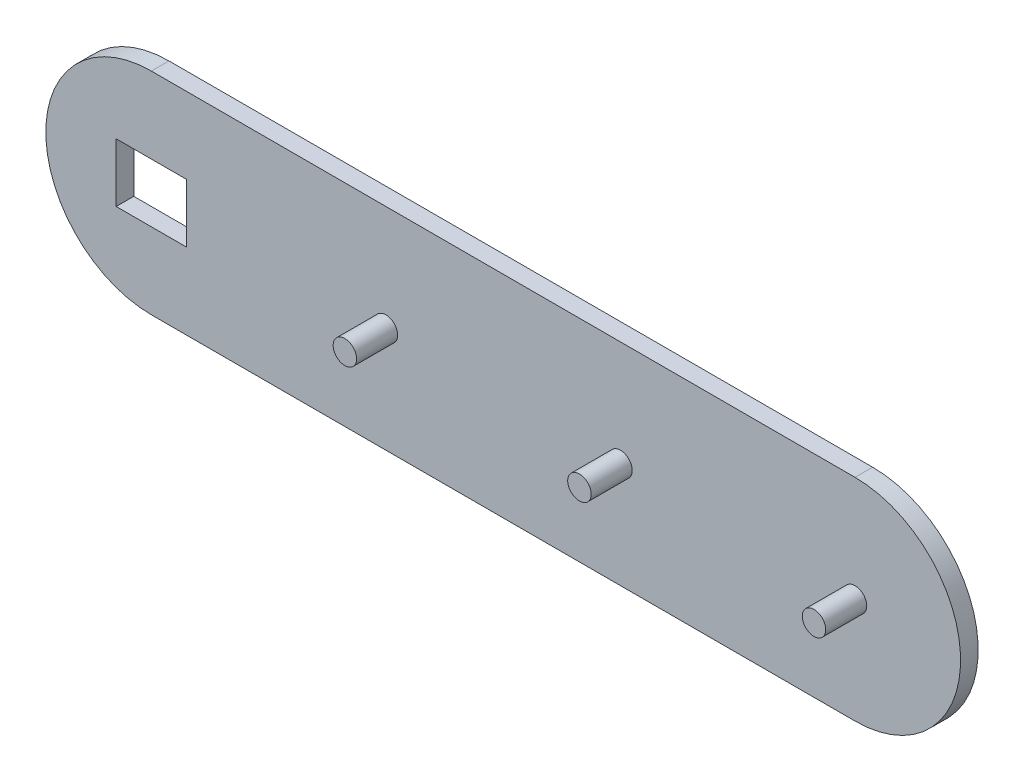
ISO-10303-21;
HEADER;
FILE_DESCRIPTION(('STEP AP214'),'2;1');
FILE_NAME('part.step','',(''),(''),'','','');
FILE_SCHEMA(('AUTOMOTIVE_DESIGN { 1 0 10303 214 1 1 1 1 }'));
ENDSEC;
DATA;
#1=APPLICATION_CONTEXT('core data for automotive mechanical design processes');
#2=APPLICATION_PROTOCOL_DEFINITION('international standard','automotive_design',2000,#1);
#3=PRODUCT_CONTEXT('',#1,'mechanical');
#4=PRODUCT('Part','Part','',(#3));
#5=PRODUCT_RELATED_PRODUCT_CATEGORY('part','',(#4));
#6=PRODUCT_DEFINITION_FORMATION('','',#4);
#7=PRODUCT_DEFINITION_CONTEXT('part definition',#1,'design');
#8=PRODUCT_DEFINITION('design','',#6,#7);
#9=PRODUCT_DEFINITION_SHAPE('','',#8);
#10=(LENGTH_UNIT() NAMED_UNIT(*) SI_UNIT(.MILLI.,.METRE.));
#11=(NAMED_UNIT(*) PLANE_ANGLE_UNIT() SI_UNIT($,.RADIAN.));
#12=(NAMED_UNIT(*) SI_UNIT($,.STERADIAN.) SOLID_ANGLE_UNIT());
#13=UNCERTAINTY_MEASURE_WITH_UNIT(LENGTH_MEASURE(1.E-05),#10,'distance_accuracy_value','');
#14=(GEOMETRIC_REPRESENTATION_CONTEXT(3) GLOBAL_UNCERTAINTY_ASSIGNED_CONTEXT((#13)) GLOBAL_UNIT_ASSIGNED_CONTEXT((#10,
#11,#12)) REPRESENTATION_CONTEXT('',''));
#15=CARTESIAN_POINT('',(0.,0.,0.));
#16=DIRECTION('',(0.,0.,1.));
#17=DIRECTION('',(1.,0.,0.));
#18=AXIS2_PLACEMENT_3D('',#15,#16,#17);
#19=CARTESIAN_POINT('',(40.,0.,10.));
#20=DIRECTION('',(0.,0.,1.));
#21=DIRECTION('',(1.,0.,0.));
#22=AXIS2_PLACEMENT_3D('',#19,#20,#21);
#23=PLANE('',#22);
#24=CARTESIAN_POINT('',(40.,0.,10.));
#25=DIRECTION('',(0.,0.,1.));
#26=DIRECTION('',(1.,0.,0.));
#27=AXIS2_PLACEMENT_3D('',#24,#25,#26);
#28=CIRCLE('',#27,2.);
#29=CARTESIAN_POINT('',(42.,0.,10.));
#30=VERTEX_POINT('',#29);
#31=EDGE_CURVE('E11',#30,#30,#28,.T.);
#32=ORIENTED_EDGE('',*,*,#31,.T.);
#33=EDGE_LOOP('',(#32));
#34=FACE_BOUND('',#33,.T.);
#35=ADVANCED_FACE('F37',(#34),#23,.T.);
#36=CARTESIAN_POINT('',(40.,0.,10.));
#37=DIRECTION('',(0.,0.,-1.));
#38=DIRECTION('',(-1.,0.,0.));
#39=AXIS2_PLACEMENT_3D('',#36,#37,#38);
#40=CYLINDRICAL_SURFACE('',#39,2.);
#41=ORIENTED_EDGE('',*,*,#31,.F.);
#42=EDGE_LOOP('',(#41));
#43=FACE_BOUND('',#42,.T.);
#44=CARTESIAN_POINT('',(40.,0.,3.));
#45=DIRECTION('',(0.,0.,1.));
#46=DIRECTION('',(1.,0.,0.));
#47=AXIS2_PLACEMENT_3D('',#44,#45,#46);
#48=CIRCLE('',#47,2.);
#49=CARTESIAN_POINT('',(42.,0.,3.));
#50=VERTEX_POINT('',#49);
#51=EDGE_CURVE('E44',#50,#50,#48,.T.);
#52=ORIENTED_EDGE('',*,*,#51,.T.);
#53=EDGE_LOOP('',(#52));
#54=FACE_BOUND('',#53,.T.);
#55=ADVANCED_FACE('F172',(#43,#54),#40,.T.);
#56=CARTESIAN_POINT('',(0.,0.,3.));
#57=DIRECTION('',(0.,0.,-1.));
#58=DIRECTION('',(-1.,0.,0.));
#59=AXIS2_PLACEMENT_3D('',#56,#57,#58);
#60=CYLINDRICAL_SURFACE('',#59,18.);
#61=CARTESIAN_POINT('',(0.,0.,0.));
#62=DIRECTION('',(0.,0.,1.));
#63=DIRECTION('',(1.,0.,0.));
#64=AXIS2_PLACEMENT_3D('',#61,#62,#63);
#65=CIRCLE('',#64,18.);
#66=CARTESIAN_POINT('',(0.,18.,0.));
#67=VERTEX_POINT('',#66);
#68=CARTESIAN_POINT('',(0.,-18.,0.));
#69=VERTEX_POINT('',#68);
#70=EDGE_CURVE('E137',#67,#69,#65,.T.);
#71=ORIENTED_EDGE('',*,*,#70,.T.);
#72=DIRECTION('',(0.,0.,-1.));
#73=VECTOR('',#72,1.);
#74=CARTESIAN_POINT('',(0.,-18.,3.));
#75=LINE('',#74,#73);
#76=CARTESIAN_POINT('',(0.,-18.,3.));
#77=VERTEX_POINT('',#76);
#78=EDGE_CURVE('E167',#77,#69,#75,.T.);
#79=ORIENTED_EDGE('',*,*,#78,.F.);
#80=CARTESIAN_POINT('',(0.,0.,3.));
#81=DIRECTION('',(0.,0.,1.));
#82=DIRECTION('',(1.,0.,0.));
#83=AXIS2_PLACEMENT_3D('',#80,#81,#82);
#84=CIRCLE('',#83,18.);
#85=CARTESIAN_POINT('',(0.,18.,3.));
#86=VERTEX_POINT('',#85);
#87=EDGE_CURVE('E141',#86,#77,#84,.T.);
#88=ORIENTED_EDGE('',*,*,#87,.F.);
#89=DIRECTION('',(0.,0.,-1.));
#90=VECTOR('',#89,1.);
#91=CARTESIAN_POINT('',(0.,18.,3.));
#92=LINE('',#91,#90);
#93=EDGE_CURVE('E151',#86,#67,#92,.T.);
#94=ORIENTED_EDGE('',*,*,#93,.T.);
#95=EDGE_LOOP('',(#71,#79,#88,#94));
#96=FACE_BOUND('',#95,.T.);
#97=ADVANCED_FACE('F195',(#96),#60,.T.);
#98=CARTESIAN_POINT('',(0.,-18.,3.));
#99=DIRECTION('',(0.,1.,0.));
#100=DIRECTION('',(0.,0.,1.));
#101=AXIS2_PLACEMENT_3D('',#98,#99,#100);
#102=PLANE('',#101);
#103=DIRECTION('',(1.,0.,0.));
#104=VECTOR('',#103,1.);
#105=CARTESIAN_POINT('',(0.,-18.,0.));
#106=LINE('',#105,#104);
#107=CARTESIAN_POINT('',(120.,-18.,0.));
#108=VERTEX_POINT('',#107);
#109=EDGE_CURVE('E154',#69,#108,#106,.T.);
#110=ORIENTED_EDGE('',*,*,#109,.T.);
#111=DIRECTION('',(0.,0.,-1.));
#112=VECTOR('',#111,1.);
#113=CARTESIAN_POINT('',(120.,-18.,3.));
#114=LINE('',#113,#112);
#115=CARTESIAN_POINT('',(120.,-18.,3.));
#116=VERTEX_POINT('',#115);
#117=EDGE_CURVE('E164',#116,#108,#114,.T.);
#118=ORIENTED_EDGE('',*,*,#117,.F.);
#119=DIRECTION('',(1.,0.,0.));
#120=VECTOR('',#119,1.);
#121=CARTESIAN_POINT('',(0.,-18.,3.));
#122=LINE('',#121,#120);
#123=EDGE_CURVE('E144',#77,#116,#122,.T.);
#124=ORIENTED_EDGE('',*,*,#123,.F.);
#125=ORIENTED_EDGE('',*,*,#78,.T.);
#126=EDGE_LOOP('',(#110,#118,#124,#125));
#127=FACE_BOUND('',#126,.T.);
#128=ADVANCED_FACE('F201',(#127),#102,.F.);
#129=CARTESIAN_POINT('',(120.,0.,3.));
#130=DIRECTION('',(0.,0.,-1.));
#131=DIRECTION('',(-1.,0.,0.));
#132=AXIS2_PLACEMENT_3D('',#129,#130,#131);
#133=CYLINDRICAL_SURFACE('',#132,18.);
#134=CARTESIAN_POINT('',(120.,0.,0.));
#135=DIRECTION('',(0.,0.,1.));
#136=DIRECTION('',(1.,0.,0.));
#137=AXIS2_PLACEMENT_3D('',#134,#135,#136);
#138=CIRCLE('',#137,18.);
#139=CARTESIAN_POINT('',(120.,18.,0.));
#140=VERTEX_POINT('',#139);
#141=EDGE_CURVE('E156',#108,#140,#138,.T.);
#142=ORIENTED_EDGE('',*,*,#141,.T.);
#143=DIRECTION('',(0.,0.,-1.));
#144=VECTOR('',#143,1.);
#145=CARTESIAN_POINT('',(120.,18.,3.));
#146=LINE('',#145,#144);
#147=CARTESIAN_POINT('',(120.,18.,3.));
#148=VERTEX_POINT('',#147);
#149=EDGE_CURVE('E161',#148,#140,#146,.T.);
#150=ORIENTED_EDGE('',*,*,#149,.F.);
#151=CARTESIAN_POINT('',(120.,0.,3.));
#152=DIRECTION('',(0.,0.,1.));
#153=DIRECTION('',(1.,0.,0.));
#154=AXIS2_PLACEMENT_3D('',#151,#152,#153);
#155=CIRCLE('',#154,18.);
#156=EDGE_CURVE('E147',#116,#148,#155,.T.);
#157=ORIENTED_EDGE('',*,*,#156,.F.);
#158=ORIENTED_EDGE('',*,*,#117,.T.);
#159=EDGE_LOOP('',(#142,#150,#157,#158));
#160=FACE_BOUND('',#159,.T.);
#161=ADVANCED_FACE('F184',(#160),#133,.T.);
#162=CARTESIAN_POINT('',(0.,18.,3.));
#163=DIRECTION('',(0.,-1.,0.));
#164=DIRECTION('',(0.,0.,-1.));
#165=AXIS2_PLACEMENT_3D('',#162,#163,#164);
#166=PLANE('',#165);
#167=DIRECTION('',(-1.,0.,0.));
#168=VECTOR('',#167,1.);
#169=CARTESIAN_POINT('',(0.,18.,0.));
#170=LINE('',#169,#168);
#171=EDGE_CURVE('E145',#140,#67,#170,.T.);
#172=ORIENTED_EDGE('',*,*,#171,.T.);
#173=ORIENTED_EDGE('',*,*,#93,.F.);
#174=DIRECTION('',(-1.,0.,0.));
#175=VECTOR('',#174,1.);
#176=CARTESIAN_POINT('',(0.,18.,3.));
#177=LINE('',#176,#175);
#178=EDGE_CURVE('E149',#148,#86,#177,.T.);
#179=ORIENTED_EDGE('',*,*,#178,.F.);
#180=ORIENTED_EDGE('',*,*,#149,.T.);
#181=EDGE_LOOP('',(#172,#173,#179,#180));
#182=FACE_BOUND('',#181,.T.);
#183=ADVANCED_FACE('F176',(#182),#166,.F.);
#184=CARTESIAN_POINT('',(0.,0.,3.));
#185=DIRECTION('',(0.,0.,1.));
#186=DIRECTION('',(1.,0.,0.));
#187=AXIS2_PLACEMENT_3D('',#184,#185,#186);
#188=PLANE('',#187);
#189=CARTESIAN_POINT('',(80.,0.,3.));
#190=DIRECTION('',(0.,0.,1.));
#191=DIRECTION('',(1.,0.,0.));
#192=AXIS2_PLACEMENT_3D('',#189,#190,#191);
#193=CIRCLE('',#192,2.);
#194=CARTESIAN_POINT('',(82.,0.,3.));
#195=VERTEX_POINT('',#194);
#196=EDGE_CURVE('E329',#195,#195,#193,.T.);
#197=ORIENTED_EDGE('',*,*,#196,.F.);
#198=EDGE_LOOP('',(#197));
#199=FACE_BOUND('',#198,.T.);
#200=CARTESIAN_POINT('',(120.,0.,3.));
#201=DIRECTION('',(0.,0.,1.));
#202=DIRECTION('',(1.,0.,0.));
#203=AXIS2_PLACEMENT_3D('',#200,#201,#202);
#204=CIRCLE('',#203,2.);
#205=CARTESIAN_POINT('',(122.,0.,3.));
#206=VERTEX_POINT('',#205);
#207=EDGE_CURVE('E124',#206,#206,#204,.T.);
#208=ORIENTED_EDGE('',*,*,#207,.F.);
#209=EDGE_LOOP('',(#208));
#210=FACE_BOUND('',#209,.T.);
#211=DIRECTION('',(1.,0.,0.));
#212=VECTOR('',#211,1.);
#213=CARTESIAN_POINT('',(-6.,-5.,3.));
#214=LINE('',#213,#212);
#215=CARTESIAN_POINT('',(-6.,-5.,3.));
#216=VERTEX_POINT('',#215);
#217=CARTESIAN_POINT('',(6.,-5.,3.));
#218=VERTEX_POINT('',#217);
#219=EDGE_CURVE('E51',#216,#218,#214,.T.);
#220=ORIENTED_EDGE('',*,*,#219,.F.);
#221=DIRECTION('',(0.,-1.,0.));
#222=VECTOR('',#221,1.);
#223=CARTESIAN_POINT('',(-6.,5.,3.));
#224=LINE('',#223,#222);
#225=CARTESIAN_POINT('',(-6.,5.,3.));
#226=VERTEX_POINT('',#225);
#227=EDGE_CURVE('E118',#226,#216,#224,.T.);
#228=ORIENTED_EDGE('',*,*,#227,.F.);
#229=DIRECTION('',(1.,0.,0.));
#230=VECTOR('',#229,1.);
#231=CARTESIAN_POINT('',(-6.,5.,3.));
#232=LINE('',#231,#230);
#233=CARTESIAN_POINT('',(6.,5.,3.));
#234=VERTEX_POINT('',#233);
#235=EDGE_CURVE('E121',#226,#234,#232,.T.);
#236=ORIENTED_EDGE('',*,*,#235,.T.);
#237=DIRECTION('',(0.,-1.,0.));
#238=VECTOR('',#237,1.);
#239=CARTESIAN_POINT('',(6.,5.,3.));
#240=LINE('',#239,#238);
#241=EDGE_CURVE('E130',#234,#218,#240,.T.);
#242=ORIENTED_EDGE('',*,*,#241,.T.);
#243=EDGE_LOOP('',(#220,#228,#236,#242));
#244=FACE_BOUND('',#243,.T.);
#245=ORIENTED_EDGE('',*,*,#87,.T.);
#246=ORIENTED_EDGE('',*,*,#123,.T.);
#247=ORIENTED_EDGE('',*,*,#156,.T.);
#248=ORIENTED_EDGE('',*,*,#178,.T.);
#249=EDGE_LOOP('',(#245,#246,#247,#248));
#250=FACE_BOUND('',#249,.T.);
#251=ORIENTED_EDGE('',*,*,#51,.F.);
#252=EDGE_LOOP('',(#251));
#253=FACE_BOUND('',#252,.T.);
#254=ADVANCED_FACE('F174',(#199,#210,#244,#250,#253),#188,.T.);
#255=CARTESIAN_POINT('',(0.,0.,0.));
#256=DIRECTION('',(0.,0.,1.));
#257=DIRECTION('',(1.,0.,0.));
#258=AXIS2_PLACEMENT_3D('',#255,#256,#257);
#259=PLANE('',#258);
#260=DIRECTION('',(0.,-1.,0.));
#261=VECTOR('',#260,1.);
#262=CARTESIAN_POINT('',(-6.,5.,0.));
#263=LINE('',#262,#261);
#264=CARTESIAN_POINT('',(-6.,5.,0.));
#265=VERTEX_POINT('',#264);
#266=CARTESIAN_POINT('',(-6.,-5.,0.));
#267=VERTEX_POINT('',#266);
#268=EDGE_CURVE('E113',#265,#267,#263,.T.);
#269=ORIENTED_EDGE('',*,*,#268,.T.);
#270=DIRECTION('',(1.,0.,0.));
#271=VECTOR('',#270,1.);
#272=CARTESIAN_POINT('',(-6.,-5.,0.));
#273=LINE('',#272,#271);
#274=CARTESIAN_POINT('',(6.,-5.,0.));
#275=VERTEX_POINT('',#274);
#276=EDGE_CURVE('E108',#267,#275,#273,.T.);
#277=ORIENTED_EDGE('',*,*,#276,.T.);
#278=DIRECTION('',(0.,-1.,0.));
#279=VECTOR('',#278,1.);
#280=CARTESIAN_POINT('',(6.,5.,0.));
#281=LINE('',#280,#279);
#282=CARTESIAN_POINT('',(6.,5.,0.));
#283=VERTEX_POINT('',#282);
#284=EDGE_CURVE('E100',#283,#275,#281,.T.);
#285=ORIENTED_EDGE('',*,*,#284,.F.);
#286=DIRECTION('',(1.,0.,0.));
#287=VECTOR('',#286,1.);
#288=CARTESIAN_POINT('',(-6.,5.,0.));
#289=LINE('',#288,#287);
#290=EDGE_CURVE('E107',#265,#283,#289,.T.);
#291=ORIENTED_EDGE('',*,*,#290,.F.);
#292=EDGE_LOOP('',(#269,#277,#285,#291));
#293=FACE_BOUND('',#292,.T.);
#294=ORIENTED_EDGE('',*,*,#70,.F.);
#295=ORIENTED_EDGE('',*,*,#171,.F.);
#296=ORIENTED_EDGE('',*,*,#141,.F.);
#297=ORIENTED_EDGE('',*,*,#109,.F.);
#298=EDGE_LOOP('',(#294,#295,#296,#297));
#299=FACE_BOUND('',#298,.T.);
#300=ADVANCED_FACE('F115',(#293,#299),#259,.F.);
#301=CARTESIAN_POINT('',(-6.,-5.,0.));
#302=DIRECTION('',(0.,-1.,0.));
#303=DIRECTION('',(0.,0.,-1.));
#304=AXIS2_PLACEMENT_3D('',#301,#302,#303);
#305=PLANE('',#304);
#306=ORIENTED_EDGE('',*,*,#219,.T.);
#307=DIRECTION('',(0.,0.,1.));
#308=VECTOR('',#307,1.);
#309=CARTESIAN_POINT('',(6.,-5.,0.));
#310=LINE('',#309,#308);
#311=EDGE_CURVE('E102',#275,#218,#310,.T.);
#312=ORIENTED_EDGE('',*,*,#311,.F.);
#313=ORIENTED_EDGE('',*,*,#276,.F.);
#314=DIRECTION('',(0.,0.,1.));
#315=VECTOR('',#314,1.);
#316=CARTESIAN_POINT('',(-6.,-5.,0.));
#317=LINE('',#316,#315);
#318=EDGE_CURVE('E135',#267,#216,#317,.T.);
#319=ORIENTED_EDGE('',*,*,#318,.T.);
#320=EDGE_LOOP('',(#306,#312,#313,#319));
#321=FACE_BOUND('',#320,.T.);
#322=ADVANCED_FACE('F111',(#321),#305,.F.);
#323=CARTESIAN_POINT('',(-6.,5.,0.));
#324=DIRECTION('',(-1.,0.,0.));
#325=DIRECTION('',(0.,-1.,0.));
#326=AXIS2_PLACEMENT_3D('',#323,#324,#325);
#327=PLANE('',#326);
#328=ORIENTED_EDGE('',*,*,#227,.T.);
#329=ORIENTED_EDGE('',*,*,#318,.F.);
#330=ORIENTED_EDGE('',*,*,#268,.F.);
#331=DIRECTION('',(0.,0.,1.));
#332=VECTOR('',#331,1.);
#333=CARTESIAN_POINT('',(-6.,5.,0.));
#334=LINE('',#333,#332);
#335=EDGE_CURVE('E138',#265,#226,#334,.T.);
#336=ORIENTED_EDGE('',*,*,#335,.T.);
#337=EDGE_LOOP('',(#328,#329,#330,#336));
#338=FACE_BOUND('',#337,.T.);
#339=ADVANCED_FACE('F245',(#338),#327,.F.);
#340=CARTESIAN_POINT('',(-6.,5.,0.));
#341=DIRECTION('',(0.,-1.,0.));
#342=DIRECTION('',(0.,0.,-1.));
#343=AXIS2_PLACEMENT_3D('',#340,#341,#342);
#344=PLANE('',#343);
#345=ORIENTED_EDGE('',*,*,#235,.F.);
#346=ORIENTED_EDGE('',*,*,#335,.F.);
#347=ORIENTED_EDGE('',*,*,#290,.T.);
#348=DIRECTION('',(0.,0.,1.));
#349=VECTOR('',#348,1.);
#350=CARTESIAN_POINT('',(6.,5.,0.));
#351=LINE('',#350,#349);
#352=EDGE_CURVE('E59',#283,#234,#351,.T.);
#353=ORIENTED_EDGE('',*,*,#352,.T.);
#354=EDGE_LOOP('',(#345,#346,#347,#353));
#355=FACE_BOUND('',#354,.T.);
#356=ADVANCED_FACE('F253',(#355),#344,.T.);
#357=CARTESIAN_POINT('',(6.,5.,0.));
#358=DIRECTION('',(-1.,0.,0.));
#359=DIRECTION('',(0.,-1.,0.));
#360=AXIS2_PLACEMENT_3D('',#357,#358,#359);
#361=PLANE('',#360);
#362=ORIENTED_EDGE('',*,*,#241,.F.);
#363=ORIENTED_EDGE('',*,*,#352,.F.);
#364=ORIENTED_EDGE('',*,*,#284,.T.);
#365=ORIENTED_EDGE('',*,*,#311,.T.);
#366=EDGE_LOOP('',(#362,#363,#364,#365));
#367=FACE_BOUND('',#366,.T.);
#368=ADVANCED_FACE('F101',(#367),#361,.T.);
#369=CARTESIAN_POINT('',(120.,0.,10.));
#370=DIRECTION('',(0.,0.,-1.));
#371=DIRECTION('',(-1.,0.,0.));
#372=AXIS2_PLACEMENT_3D('',#369,#370,#371);
#373=CYLINDRICAL_SURFACE('',#372,2.);
#374=CARTESIAN_POINT('',(120.,0.,10.));
#375=DIRECTION('',(0.,0.,1.));
#376=DIRECTION('',(1.,0.,0.));
#377=AXIS2_PLACEMENT_3D('',#374,#375,#376);
#378=CIRCLE('',#377,2.);
#379=CARTESIAN_POINT('',(122.,0.,10.));
#380=VERTEX_POINT('',#379);
#381=EDGE_CURVE('E131',#380,#380,#378,.T.);
#382=ORIENTED_EDGE('',*,*,#381,.F.);
#383=EDGE_LOOP('',(#382));
#384=FACE_BOUND('',#383,.T.);
#385=ORIENTED_EDGE('',*,*,#207,.T.);
#386=EDGE_LOOP('',(#385));
#387=FACE_BOUND('',#386,.T.);
#388=ADVANCED_FACE('F272',(#384,#387),#373,.T.);
#389=CARTESIAN_POINT('',(120.,0.,10.));
#390=DIRECTION('',(0.,0.,1.));
#391=DIRECTION('',(1.,0.,0.));
#392=AXIS2_PLACEMENT_3D('',#389,#390,#391);
#393=PLANE('',#392);
#394=ORIENTED_EDGE('',*,*,#381,.T.);
#395=EDGE_LOOP('',(#394));
#396=FACE_BOUND('',#395,.T.);
#397=ADVANCED_FACE('F281',(#396),#393,.T.);
#398=CARTESIAN_POINT('',(80.,0.,10.));
#399=DIRECTION('',(0.,0.,-1.));
#400=DIRECTION('',(-1.,0.,0.));
#401=AXIS2_PLACEMENT_3D('',#398,#399,#400);
#402=CYLINDRICAL_SURFACE('',#401,2.);
#403=CARTESIAN_POINT('',(80.,0.,10.));
#404=DIRECTION('',(0.,0.,1.));
#405=DIRECTION('',(1.,0.,0.));
#406=AXIS2_PLACEMENT_3D('',#403,#404,#405);
#407=CIRCLE('',#406,2.);
#408=CARTESIAN_POINT('',(82.,0.,10.));
#409=VERTEX_POINT('',#408);
#410=EDGE_CURVE('E328',#409,#409,#407,.T.);
#411=ORIENTED_EDGE('',*,*,#410,.F.);
#412=EDGE_LOOP('',(#411));
#413=FACE_BOUND('',#412,.T.);
#414=ORIENTED_EDGE('',*,*,#196,.T.);
#415=EDGE_LOOP('',(#414));
#416=FACE_BOUND('',#415,.T.);
#417=ADVANCED_FACE('F290',(#413,#416),#402,.T.);
#418=CARTESIAN_POINT('',(80.,0.,10.));
#419=DIRECTION('',(0.,0.,1.));
#420=DIRECTION('',(1.,0.,0.));
#421=AXIS2_PLACEMENT_3D('',#418,#419,#420);
#422=PLANE('',#421);
#423=ORIENTED_EDGE('',*,*,#410,.T.);
#424=EDGE_LOOP('',(#423));
#425=FACE_BOUND('',#424,.T.);
#426=ADVANCED_FACE('F312',(#425),#422,.T.);
#427=CLOSED_SHELL('',(#35,#55,#97,#128,#161,#183,#254,#300,#322,#339,#356,#368,#388,#397,#417,#426));
#428=MANIFOLD_SOLID_BREP('B2',#427);
#429=ADVANCED_BREP_SHAPE_REPRESENTATION('',(#18,#428),#14);
#430=SHAPE_DEFINITION_REPRESENTATION(#9,#429);
ENDSEC;
END-ISO-10303-21;
